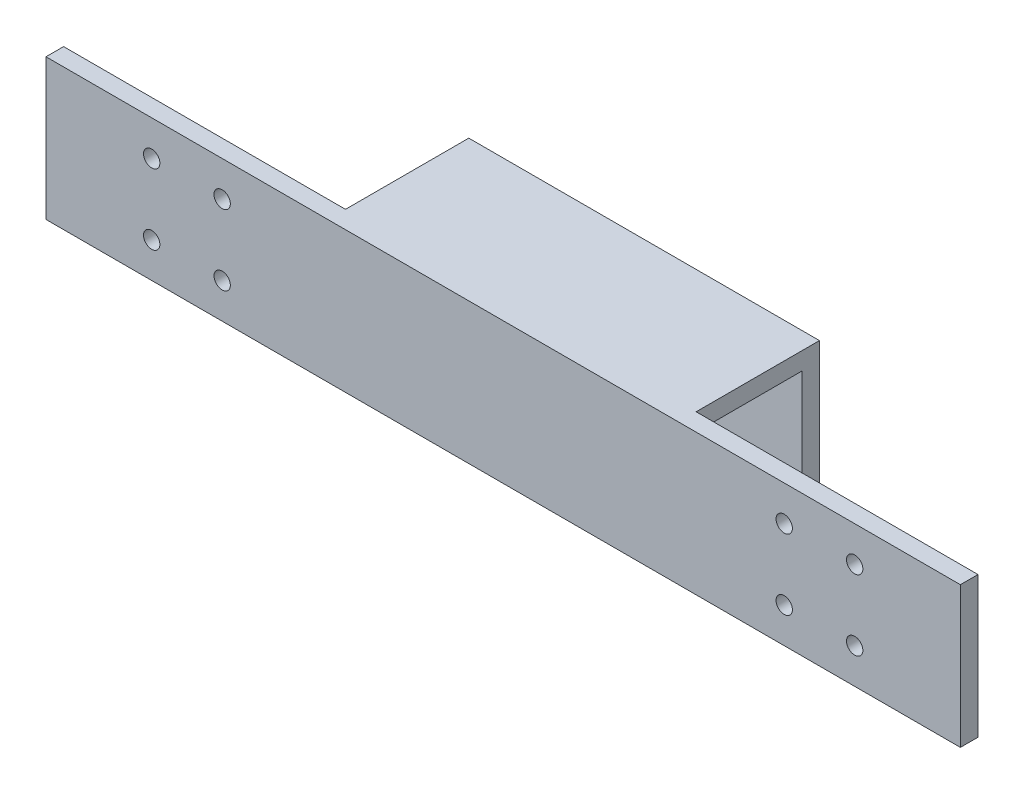
ISO-10303-21;
HEADER;
FILE_DESCRIPTION(('STEP AP214'),'2;1');
FILE_NAME('part.step','',(''),(''),'','','');
FILE_SCHEMA(('AUTOMOTIVE_DESIGN { 1 0 10303 214 1 1 1 1 }'));
ENDSEC;
DATA;
#1=APPLICATION_CONTEXT('core data for automotive mechanical design processes');
#2=APPLICATION_PROTOCOL_DEFINITION('international standard','automotive_design',2000,#1);
#3=PRODUCT_CONTEXT('',#1,'mechanical');
#4=PRODUCT('Part','Part','',(#3));
#5=PRODUCT_RELATED_PRODUCT_CATEGORY('part','',(#4));
#6=PRODUCT_DEFINITION_FORMATION('','',#4);
#7=PRODUCT_DEFINITION_CONTEXT('part definition',#1,'design');
#8=PRODUCT_DEFINITION('design','',#6,#7);
#9=PRODUCT_DEFINITION_SHAPE('','',#8);
#10=(LENGTH_UNIT() NAMED_UNIT(*) SI_UNIT(.MILLI.,.METRE.));
#11=(NAMED_UNIT(*) PLANE_ANGLE_UNIT() SI_UNIT($,.RADIAN.));
#12=(NAMED_UNIT(*) SI_UNIT($,.STERADIAN.) SOLID_ANGLE_UNIT());
#13=UNCERTAINTY_MEASURE_WITH_UNIT(LENGTH_MEASURE(1.E-05),#10,'distance_accuracy_value','');
#14=(GEOMETRIC_REPRESENTATION_CONTEXT(3) GLOBAL_UNCERTAINTY_ASSIGNED_CONTEXT((#13)) GLOBAL_UNIT_ASSIGNED_CONTEXT((#10,
#11,#12)) REPRESENTATION_CONTEXT('',''));
#15=CARTESIAN_POINT('',(0.,0.,0.));
#16=DIRECTION('',(0.,0.,1.));
#17=DIRECTION('',(1.,0.,0.));
#18=AXIS2_PLACEMENT_3D('',#15,#16,#17);
#19=CARTESIAN_POINT('',(164.8,8.11967213114754,-16.1005464480874));
#20=DIRECTION('',(0.,0.,1.));
#21=DIRECTION('',(0.,-1.,0.));
#22=AXIS2_PLACEMENT_3D('',#19,#20,#21);
#23=PLANE('',#22);
#24=DIRECTION('',(0.,-1.,0.));
#25=VECTOR('',#24,1.);
#26=CARTESIAN_POINT('',(50.8,8.11967213114754,-16.1005464480874));
#27=LINE('',#26,#25);
#28=CARTESIAN_POINT('',(50.8,8.11967213114754,-16.1005464480874));
#29=VERTEX_POINT('',#28);
#30=CARTESIAN_POINT('',(50.8,-17.2803278688525,-16.1005464480874));
#31=VERTEX_POINT('',#30);
#32=EDGE_CURVE('E128',#29,#31,#27,.T.);
#33=ORIENTED_EDGE('',*,*,#32,.F.);
#34=DIRECTION('',(-1.,0.,0.));
#35=VECTOR('',#34,1.);
#36=CARTESIAN_POINT('',(164.8,8.11967213114754,-16.1005464480874));
#37=LINE('',#36,#35);
#38=CARTESIAN_POINT('',(114.,8.11967213114754,-16.1005464480874));
#39=VERTEX_POINT('',#38);
#40=EDGE_CURVE('E156',#39,#29,#37,.T.);
#41=ORIENTED_EDGE('',*,*,#40,.F.);
#42=DIRECTION('',(0.,1.,0.));
#43=VECTOR('',#42,1.);
#44=CARTESIAN_POINT('',(114.,8.11967213114754,-16.1005464480874));
#45=LINE('',#44,#43);
#46=CARTESIAN_POINT('',(114.,-17.2803278688525,-16.1005464480874));
#47=VERTEX_POINT('',#46);
#48=EDGE_CURVE('E153',#47,#39,#45,.T.);
#49=ORIENTED_EDGE('',*,*,#48,.F.);
#50=DIRECTION('',(-1.,0.,0.));
#51=VECTOR('',#50,1.);
#52=CARTESIAN_POINT('',(164.8,-17.2803278688525,-16.1005464480874));
#53=LINE('',#52,#51);
#54=EDGE_CURVE('E146',#47,#31,#53,.T.);
#55=ORIENTED_EDGE('',*,*,#54,.T.);
#56=EDGE_LOOP('',(#33,#41,#49,#55));
#57=FACE_BOUND('',#56,.T.);
#58=ADVANCED_FACE('F38',(#57),#23,.F.);
#59=CARTESIAN_POINT('',(164.8,-14.1053278688525,6.12445355191256));
#60=DIRECTION('',(0.,1.,0.));
#61=DIRECTION('',(0.,0.,1.));
#62=AXIS2_PLACEMENT_3D('',#59,#60,#61);
#63=PLANE('',#62);
#64=DIRECTION('',(-1.,0.,0.));
#65=VECTOR('',#64,1.);
#66=CARTESIAN_POINT('',(164.8,-14.1053278688525,-12.9255464480874));
#67=LINE('',#66,#65);
#68=CARTESIAN_POINT('',(114.,-14.1053278688525,-12.9255464480874));
#69=VERTEX_POINT('',#68);
#70=CARTESIAN_POINT('',(50.8,-14.1053278688525,-12.9255464480874));
#71=VERTEX_POINT('',#70);
#72=EDGE_CURVE('E243',#69,#71,#67,.T.);
#73=ORIENTED_EDGE('',*,*,#72,.T.);
#74=DIRECTION('',(0.,0.,1.));
#75=VECTOR('',#74,1.);
#76=CARTESIAN_POINT('',(50.8,-14.1053278688525,6.12445355191256));
#77=LINE('',#76,#75);
#78=CARTESIAN_POINT('',(50.8,-14.1053278688525,6.12445355191256));
#79=VERTEX_POINT('',#78);
#80=EDGE_CURVE('E323',#71,#79,#77,.T.);
#81=ORIENTED_EDGE('',*,*,#80,.T.);
#82=DIRECTION('',(-1.,0.,0.));
#83=VECTOR('',#82,1.);
#84=CARTESIAN_POINT('',(164.8,-14.1053278688525,6.12445355191256));
#85=LINE('',#84,#83);
#86=CARTESIAN_POINT('',(114.,-14.1053278688525,6.12445355191256));
#87=VERTEX_POINT('',#86);
#88=EDGE_CURVE('E252',#87,#79,#85,.T.);
#89=ORIENTED_EDGE('',*,*,#88,.F.);
#90=DIRECTION('',(0.,0.,1.));
#91=VECTOR('',#90,1.);
#92=CARTESIAN_POINT('',(114.,-14.1053278688525,6.12445355191256));
#93=LINE('',#92,#91);
#94=EDGE_CURVE('E309',#69,#87,#93,.T.);
#95=ORIENTED_EDGE('',*,*,#94,.F.);
#96=EDGE_LOOP('',(#73,#81,#89,#95));
#97=FACE_BOUND('',#96,.T.);
#98=ADVANCED_FACE('F322',(#97),#63,.T.);
#99=CARTESIAN_POINT('',(164.8,4.94467213114754,-12.9255464480874));
#100=DIRECTION('',(0.,0.,1.));
#101=DIRECTION('',(1.,0.,0.));
#102=AXIS2_PLACEMENT_3D('',#99,#100,#101);
#103=PLANE('',#102);
#104=DIRECTION('',(-1.,0.,0.));
#105=VECTOR('',#104,1.);
#106=CARTESIAN_POINT('',(164.8,4.94467213114754,-12.9255464480874));
#107=LINE('',#106,#105);
#108=CARTESIAN_POINT('',(114.,4.94467213114754,-12.9255464480874));
#109=VERTEX_POINT('',#108);
#110=CARTESIAN_POINT('',(50.8,4.94467213114754,-12.9255464480874));
#111=VERTEX_POINT('',#110);
#112=EDGE_CURVE('E238',#109,#111,#107,.T.);
#113=ORIENTED_EDGE('',*,*,#112,.T.);
#114=DIRECTION('',(0.,-1.,0.));
#115=VECTOR('',#114,1.);
#116=CARTESIAN_POINT('',(50.8,4.94467213114754,-12.9255464480874));
#117=LINE('',#116,#115);
#118=EDGE_CURVE('E56',#111,#71,#117,.T.);
#119=ORIENTED_EDGE('',*,*,#118,.T.);
#120=ORIENTED_EDGE('',*,*,#72,.F.);
#121=DIRECTION('',(0.,-1.,0.));
#122=VECTOR('',#121,1.);
#123=CARTESIAN_POINT('',(114.,4.94467213114754,-12.9255464480874));
#124=LINE('',#123,#122);
#125=EDGE_CURVE('E303',#109,#69,#124,.T.);
#126=ORIENTED_EDGE('',*,*,#125,.F.);
#127=EDGE_LOOP('',(#113,#119,#120,#126));
#128=FACE_BOUND('',#127,.T.);
#129=ADVANCED_FACE('F404',(#128),#103,.T.);
#130=CARTESIAN_POINT('',(164.8,4.94467213114754,6.12445355191256));
#131=DIRECTION('',(0.,-1.,0.));
#132=DIRECTION('',(0.,0.,-1.));
#133=AXIS2_PLACEMENT_3D('',#130,#131,#132);
#134=PLANE('',#133);
#135=DIRECTION('',(-1.,0.,0.));
#136=VECTOR('',#135,1.);
#137=CARTESIAN_POINT('',(164.8,4.94467213114754,6.12445355191256));
#138=LINE('',#137,#136);
#139=CARTESIAN_POINT('',(114.,4.94467213114754,6.12445355191256));
#140=VERTEX_POINT('',#139);
#141=CARTESIAN_POINT('',(50.8,4.94467213114754,6.12445355191256));
#142=VERTEX_POINT('',#141);
#143=EDGE_CURVE('E227',#140,#142,#138,.T.);
#144=ORIENTED_EDGE('',*,*,#143,.T.);
#145=DIRECTION('',(0.,0.,-1.));
#146=VECTOR('',#145,1.);
#147=CARTESIAN_POINT('',(50.8,4.94467213114754,6.12445355191256));
#148=LINE('',#147,#146);
#149=EDGE_CURVE('E11',#142,#111,#148,.T.);
#150=ORIENTED_EDGE('',*,*,#149,.T.);
#151=ORIENTED_EDGE('',*,*,#112,.F.);
#152=DIRECTION('',(0.,0.,-1.));
#153=VECTOR('',#152,1.);
#154=CARTESIAN_POINT('',(114.,4.94467213114754,6.12445355191256));
#155=LINE('',#154,#153);
#156=EDGE_CURVE('E48',#140,#109,#155,.T.);
#157=ORIENTED_EDGE('',*,*,#156,.F.);
#158=EDGE_LOOP('',(#144,#150,#151,#157));
#159=FACE_BOUND('',#158,.T.);
#160=ADVANCED_FACE('F234',(#159),#134,.T.);
#161=CARTESIAN_POINT('',(164.8,0.,0.));
#162=DIRECTION('',(1.,0.,0.));
#163=DIRECTION('',(0.,0.,-1.));
#164=AXIS2_PLACEMENT_3D('',#161,#162,#163);
#165=PLANE('',#164);
#166=DIRECTION('',(0.,-1.,0.));
#167=VECTOR('',#166,1.);
#168=CARTESIAN_POINT('',(164.8,4.94467213114754,6.12445355191256));
#169=LINE('',#168,#167);
#170=CARTESIAN_POINT('',(164.8,8.11967213114754,6.12445355191256));
#171=VERTEX_POINT('',#170);
#172=CARTESIAN_POINT('',(164.8,-17.2803278688525,6.12445355191256));
#173=VERTEX_POINT('',#172);
#174=EDGE_CURVE('E239',#171,#173,#169,.T.);
#175=ORIENTED_EDGE('',*,*,#174,.F.);
#176=DIRECTION('',(0.,0.,1.));
#177=VECTOR('',#176,1.);
#178=CARTESIAN_POINT('',(164.8,8.11967213114754,9.29945355191256));
#179=LINE('',#178,#177);
#180=CARTESIAN_POINT('',(164.8,8.11967213114754,9.29945355191256));
#181=VERTEX_POINT('',#180);
#182=EDGE_CURVE('E266',#171,#181,#179,.T.);
#183=ORIENTED_EDGE('',*,*,#182,.T.);
#184=DIRECTION('',(0.,-1.,0.));
#185=VECTOR('',#184,1.);
#186=CARTESIAN_POINT('',(164.8,8.11967213114754,9.29945355191256));
#187=LINE('',#186,#185);
#188=CARTESIAN_POINT('',(164.8,-17.2803278688525,9.29945355191256));
#189=VERTEX_POINT('',#188);
#190=EDGE_CURVE('E257',#181,#189,#187,.T.);
#191=ORIENTED_EDGE('',*,*,#190,.T.);
#192=DIRECTION('',(0.,0.,-1.));
#193=VECTOR('',#192,1.);
#194=CARTESIAN_POINT('',(164.8,-17.2803278688525,9.29945355191256));
#195=LINE('',#194,#193);
#196=EDGE_CURVE('E261',#189,#173,#195,.T.);
#197=ORIENTED_EDGE('',*,*,#196,.T.);
#198=EDGE_LOOP('',(#175,#183,#191,#197));
#199=FACE_BOUND('',#198,.T.);
#200=ADVANCED_FACE('F292',(#199),#165,.T.);
#201=CARTESIAN_POINT('',(0.,0.,0.));
#202=DIRECTION('',(1.,0.,0.));
#203=DIRECTION('',(0.,0.,-1.));
#204=AXIS2_PLACEMENT_3D('',#201,#202,#203);
#205=PLANE('',#204);
#206=DIRECTION('',(0.,0.,1.));
#207=VECTOR('',#206,1.);
#208=CARTESIAN_POINT('',(0.,8.11967213114754,9.29945355191256));
#209=LINE('',#208,#207);
#210=CARTESIAN_POINT('',(0.,8.11967213114754,6.12445355191256));
#211=VERTEX_POINT('',#210);
#212=CARTESIAN_POINT('',(0.,8.11967213114754,9.29945355191256));
#213=VERTEX_POINT('',#212);
#214=EDGE_CURVE('E262',#211,#213,#209,.T.);
#215=ORIENTED_EDGE('',*,*,#214,.F.);
#216=DIRECTION('',(0.,-1.,0.));
#217=VECTOR('',#216,1.);
#218=CARTESIAN_POINT('',(0.,4.94467213114754,6.12445355191256));
#219=LINE('',#218,#217);
#220=CARTESIAN_POINT('',(0.,-17.2803278688525,6.12445355191256));
#221=VERTEX_POINT('',#220);
#222=EDGE_CURVE('E245',#211,#221,#219,.T.);
#223=ORIENTED_EDGE('',*,*,#222,.T.);
#224=DIRECTION('',(0.,0.,-1.));
#225=VECTOR('',#224,1.);
#226=CARTESIAN_POINT('',(0.,-17.2803278688525,9.29945355191256));
#227=LINE('',#226,#225);
#228=CARTESIAN_POINT('',(0.,-17.2803278688525,9.29945355191256));
#229=VERTEX_POINT('',#228);
#230=EDGE_CURVE('E272',#229,#221,#227,.T.);
#231=ORIENTED_EDGE('',*,*,#230,.F.);
#232=DIRECTION('',(0.,-1.,0.));
#233=VECTOR('',#232,1.);
#234=CARTESIAN_POINT('',(0.,8.11967213114754,9.29945355191256));
#235=LINE('',#234,#233);
#236=EDGE_CURVE('E256',#213,#229,#235,.T.);
#237=ORIENTED_EDGE('',*,*,#236,.F.);
#238=EDGE_LOOP('',(#215,#223,#231,#237));
#239=FACE_BOUND('',#238,.T.);
#240=ADVANCED_FACE('F287',(#239),#205,.F.);
#241=CARTESIAN_POINT('',(164.8,8.11967213114754,9.29945355191256));
#242=DIRECTION('',(0.,0.,-1.));
#243=DIRECTION('',(0.,1.,0.));
#244=AXIS2_PLACEMENT_3D('',#241,#242,#243);
#245=PLANE('',#244);
#246=CARTESIAN_POINT('',(145.75,-10.9303278688525,9.29945355191256));
#247=DIRECTION('',(0.,0.,1.));
#248=DIRECTION('',(1.,0.,0.));
#249=AXIS2_PLACEMENT_3D('',#246,#247,#248);
#250=CIRCLE('',#249,1.4732);
#251=CARTESIAN_POINT('',(147.2232,-10.9303278688525,9.29945355191256));
#252=VERTEX_POINT('',#251);
#253=EDGE_CURVE('E353',#252,#252,#250,.T.);
#254=ORIENTED_EDGE('',*,*,#253,.F.);
#255=EDGE_LOOP('',(#254));
#256=FACE_BOUND('',#255,.T.);
#257=CARTESIAN_POINT('',(19.05,-10.9303278688525,9.29945355191256));
#258=DIRECTION('',(0.,0.,1.));
#259=DIRECTION('',(-1.,0.,0.));
#260=AXIS2_PLACEMENT_3D('',#257,#258,#259);
#261=CIRCLE('',#260,1.4732);
#262=CARTESIAN_POINT('',(17.5768,-10.9303278688525,9.29945355191256));
#263=VERTEX_POINT('',#262);
#264=EDGE_CURVE('E349',#263,#263,#261,.T.);
#265=ORIENTED_EDGE('',*,*,#264,.F.);
#266=EDGE_LOOP('',(#265));
#267=FACE_BOUND('',#266,.T.);
#268=CARTESIAN_POINT('',(31.75,-10.9303278688525,9.29945355191256));
#269=DIRECTION('',(0.,0.,1.));
#270=DIRECTION('',(1.,0.,0.));
#271=AXIS2_PLACEMENT_3D('',#268,#269,#270);
#272=CIRCLE('',#271,1.47319999999999);
#273=CARTESIAN_POINT('',(33.2232,-10.9303278688525,9.29945355191256));
#274=VERTEX_POINT('',#273);
#275=EDGE_CURVE('E345',#274,#274,#272,.T.);
#276=ORIENTED_EDGE('',*,*,#275,.F.);
#277=EDGE_LOOP('',(#276));
#278=FACE_BOUND('',#277,.T.);
#279=CARTESIAN_POINT('',(31.75,1.76967213114754,9.29945355191256));
#280=DIRECTION('',(0.,0.,1.));
#281=DIRECTION('',(-1.,0.,0.));
#282=AXIS2_PLACEMENT_3D('',#279,#280,#281);
#283=CIRCLE('',#282,1.4732);
#284=CARTESIAN_POINT('',(30.2768,1.76967213114754,9.29945355191256));
#285=VERTEX_POINT('',#284);
#286=EDGE_CURVE('E344',#285,#285,#283,.T.);
#287=ORIENTED_EDGE('',*,*,#286,.F.);
#288=EDGE_LOOP('',(#287));
#289=FACE_BOUND('',#288,.T.);
#290=CARTESIAN_POINT('',(133.05,-10.9303278688525,9.29945355191256));
#291=DIRECTION('',(0.,0.,1.));
#292=DIRECTION('',(-1.,0.,0.));
#293=AXIS2_PLACEMENT_3D('',#290,#291,#292);
#294=CIRCLE('',#293,1.4732);
#295=CARTESIAN_POINT('',(131.5768,-10.9303278688525,9.29945355191256));
#296=VERTEX_POINT('',#295);
#297=EDGE_CURVE('E357',#296,#296,#294,.T.);
#298=ORIENTED_EDGE('',*,*,#297,.F.);
#299=EDGE_LOOP('',(#298));
#300=FACE_BOUND('',#299,.T.);
#301=CARTESIAN_POINT('',(133.05,1.76967213114754,9.29945355191256));
#302=DIRECTION('',(0.,0.,1.));
#303=DIRECTION('',(1.,0.,0.));
#304=AXIS2_PLACEMENT_3D('',#301,#302,#303);
#305=CIRCLE('',#304,1.4732);
#306=CARTESIAN_POINT('',(134.5232,1.76967213114754,9.29945355191256));
#307=VERTEX_POINT('',#306);
#308=EDGE_CURVE('E365',#307,#307,#305,.T.);
#309=ORIENTED_EDGE('',*,*,#308,.F.);
#310=EDGE_LOOP('',(#309));
#311=FACE_BOUND('',#310,.T.);
#312=CARTESIAN_POINT('',(145.75,1.76967213114754,9.29945355191256));
#313=DIRECTION('',(0.,0.,1.));
#314=DIRECTION('',(-1.,0.,0.));
#315=AXIS2_PLACEMENT_3D('',#312,#313,#314);
#316=CIRCLE('',#315,1.4732);
#317=CARTESIAN_POINT('',(144.2768,1.76967213114754,9.29945355191256));
#318=VERTEX_POINT('',#317);
#319=EDGE_CURVE('E361',#318,#318,#316,.T.);
#320=ORIENTED_EDGE('',*,*,#319,.F.);
#321=EDGE_LOOP('',(#320));
#322=FACE_BOUND('',#321,.T.);
#323=CARTESIAN_POINT('',(19.05,1.76967213114754,9.29945355191256));
#324=DIRECTION('',(0.,0.,1.));
#325=DIRECTION('',(1.,0.,0.));
#326=AXIS2_PLACEMENT_3D('',#323,#324,#325);
#327=CIRCLE('',#326,1.4732);
#328=CARTESIAN_POINT('',(20.5232,1.76967213114754,9.29945355191256));
#329=VERTEX_POINT('',#328);
#330=EDGE_CURVE('E173',#329,#329,#327,.T.);
#331=ORIENTED_EDGE('',*,*,#330,.F.);
#332=EDGE_LOOP('',(#331));
#333=FACE_BOUND('',#332,.T.);
#334=ORIENTED_EDGE('',*,*,#236,.T.);
#335=DIRECTION('',(-1.,0.,0.));
#336=VECTOR('',#335,1.);
#337=CARTESIAN_POINT('',(164.8,-17.2803278688525,9.29945355191256));
#338=LINE('',#337,#336);
#339=EDGE_CURVE('E155',#189,#229,#338,.T.);
#340=ORIENTED_EDGE('',*,*,#339,.F.);
#341=ORIENTED_EDGE('',*,*,#190,.F.);
#342=DIRECTION('',(-1.,0.,0.));
#343=VECTOR('',#342,1.);
#344=CARTESIAN_POINT('',(164.8,8.11967213114754,9.29945355191256));
#345=LINE('',#344,#343);
#346=EDGE_CURVE('E162',#181,#213,#345,.T.);
#347=ORIENTED_EDGE('',*,*,#346,.T.);
#348=EDGE_LOOP('',(#334,#340,#341,#347));
#349=FACE_BOUND('',#348,.T.);
#350=ADVANCED_FACE('F40',(#256,#267,#278,#289,#300,#311,#322,#333,#349),#245,.F.);
#351=CARTESIAN_POINT('',(164.8,-17.2803278688525,9.29945355191256));
#352=DIRECTION('',(0.,1.,0.));
#353=DIRECTION('',(0.,0.,1.));
#354=AXIS2_PLACEMENT_3D('',#351,#352,#353);
#355=PLANE('',#354);
#356=ORIENTED_EDGE('',*,*,#230,.T.);
#357=DIRECTION('',(-1.,0.,0.));
#358=VECTOR('',#357,1.);
#359=CARTESIAN_POINT('',(50.8,-17.2803278688525,6.12445355191256));
#360=LINE('',#359,#358);
#361=CARTESIAN_POINT('',(50.8,-17.2803278688525,6.12445355191256));
#362=VERTEX_POINT('',#361);
#363=EDGE_CURVE('E148',#362,#221,#360,.T.);
#364=ORIENTED_EDGE('',*,*,#363,.F.);
#365=DIRECTION('',(0.,0.,1.));
#366=VECTOR('',#365,1.);
#367=CARTESIAN_POINT('',(50.8,-17.2803278688525,-16.1005464480874));
#368=LINE('',#367,#366);
#369=EDGE_CURVE('E131',#31,#362,#368,.T.);
#370=ORIENTED_EDGE('',*,*,#369,.F.);
#371=ORIENTED_EDGE('',*,*,#54,.F.);
#372=DIRECTION('',(0.,0.,-1.));
#373=VECTOR('',#372,1.);
#374=CARTESIAN_POINT('',(114.,-17.2803278688525,-16.1005464480874));
#375=LINE('',#374,#373);
#376=CARTESIAN_POINT('',(114.,-17.2803278688525,6.12445355191256));
#377=VERTEX_POINT('',#376);
#378=EDGE_CURVE('E299',#377,#47,#375,.T.);
#379=ORIENTED_EDGE('',*,*,#378,.F.);
#380=DIRECTION('',(1.,0.,0.));
#381=VECTOR('',#380,1.);
#382=CARTESIAN_POINT('',(114.,-17.2803278688525,6.12445355191256));
#383=LINE('',#382,#381);
#384=EDGE_CURVE('E290',#377,#173,#383,.T.);
#385=ORIENTED_EDGE('',*,*,#384,.T.);
#386=ORIENTED_EDGE('',*,*,#196,.F.);
#387=ORIENTED_EDGE('',*,*,#339,.T.);
#388=EDGE_LOOP('',(#356,#364,#370,#371,#379,#385,#386,#387));
#389=FACE_BOUND('',#388,.T.);
#390=ADVANCED_FACE('F144',(#389),#355,.F.);
#391=CARTESIAN_POINT('',(164.8,8.11967213114754,9.29945355191256));
#392=DIRECTION('',(0.,-1.,0.));
#393=DIRECTION('',(0.,0.,-1.));
#394=AXIS2_PLACEMENT_3D('',#391,#392,#393);
#395=PLANE('',#394);
#396=DIRECTION('',(0.,0.,-1.));
#397=VECTOR('',#396,1.);
#398=CARTESIAN_POINT('',(50.8,8.11967213114754,-16.1005464480874));
#399=LINE('',#398,#397);
#400=CARTESIAN_POINT('',(50.8,8.11967213114754,6.12445355191256));
#401=VERTEX_POINT('',#400);
#402=EDGE_CURVE('E134',#401,#29,#399,.T.);
#403=ORIENTED_EDGE('',*,*,#402,.F.);
#404=DIRECTION('',(-1.,0.,0.));
#405=VECTOR('',#404,1.);
#406=CARTESIAN_POINT('',(50.8,8.11967213114754,6.12445355191256));
#407=LINE('',#406,#405);
#408=EDGE_CURVE('E229',#401,#211,#407,.T.);
#409=ORIENTED_EDGE('',*,*,#408,.T.);
#410=ORIENTED_EDGE('',*,*,#214,.T.);
#411=ORIENTED_EDGE('',*,*,#346,.F.);
#412=ORIENTED_EDGE('',*,*,#182,.F.);
#413=DIRECTION('',(1.,0.,0.));
#414=VECTOR('',#413,1.);
#415=CARTESIAN_POINT('',(114.,8.11967213114754,6.12445355191256));
#416=LINE('',#415,#414);
#417=CARTESIAN_POINT('',(114.,8.11967213114754,6.12445355191256));
#418=VERTEX_POINT('',#417);
#419=EDGE_CURVE('E296',#418,#171,#416,.T.);
#420=ORIENTED_EDGE('',*,*,#419,.F.);
#421=DIRECTION('',(0.,0.,1.));
#422=VECTOR('',#421,1.);
#423=CARTESIAN_POINT('',(114.,8.11967213114754,-16.1005464480874));
#424=LINE('',#423,#422);
#425=EDGE_CURVE('E297',#39,#418,#424,.T.);
#426=ORIENTED_EDGE('',*,*,#425,.F.);
#427=ORIENTED_EDGE('',*,*,#40,.T.);
#428=EDGE_LOOP('',(#403,#409,#410,#411,#412,#420,#426,#427));
#429=FACE_BOUND('',#428,.T.);
#430=ADVANCED_FACE('F208',(#429),#395,.F.);
#431=CARTESIAN_POINT('',(164.8,4.94467213114754,6.12445355191256));
#432=DIRECTION('',(0.,0.,-1.));
#433=DIRECTION('',(-1.,0.,0.));
#434=AXIS2_PLACEMENT_3D('',#431,#432,#433);
#435=PLANE('',#434);
#436=CARTESIAN_POINT('',(145.75,-10.9303278688525,6.12445355191257));
#437=DIRECTION('',(0.,0.,-1.));
#438=DIRECTION('',(-1.,0.,0.));
#439=AXIS2_PLACEMENT_3D('',#436,#437,#438);
#440=CIRCLE('',#439,1.4732);
#441=CARTESIAN_POINT('',(144.2768,-10.9303278688525,6.12445355191257));
#442=VERTEX_POINT('',#441);
#443=EDGE_CURVE('E42',#442,#442,#440,.T.);
#444=ORIENTED_EDGE('',*,*,#443,.F.);
#445=EDGE_LOOP('',(#444));
#446=FACE_BOUND('',#445,.T.);
#447=CARTESIAN_POINT('',(19.05,-10.9303278688525,6.12445355191257));
#448=DIRECTION('',(0.,0.,-1.));
#449=DIRECTION('',(-1.,0.,0.));
#450=AXIS2_PLACEMENT_3D('',#447,#448,#449);
#451=CIRCLE('',#450,1.4732);
#452=CARTESIAN_POINT('',(17.5768,-10.9303278688525,6.12445355191257));
#453=VERTEX_POINT('',#452);
#454=EDGE_CURVE('E192',#453,#453,#451,.T.);
#455=ORIENTED_EDGE('',*,*,#454,.F.);
#456=EDGE_LOOP('',(#455));
#457=FACE_BOUND('',#456,.T.);
#458=CARTESIAN_POINT('',(31.75,-10.9303278688525,6.12445355191257));
#459=DIRECTION('',(0.,0.,-1.));
#460=DIRECTION('',(-1.,0.,0.));
#461=AXIS2_PLACEMENT_3D('',#458,#459,#460);
#462=CIRCLE('',#461,1.47319999999999);
#463=CARTESIAN_POINT('',(30.2768,-10.9303278688525,6.12445355191257));
#464=VERTEX_POINT('',#463);
#465=EDGE_CURVE('E189',#464,#464,#462,.T.);
#466=ORIENTED_EDGE('',*,*,#465,.F.);
#467=EDGE_LOOP('',(#466));
#468=FACE_BOUND('',#467,.T.);
#469=CARTESIAN_POINT('',(31.75,1.76967213114754,6.12445355191257));
#470=DIRECTION('',(0.,0.,-1.));
#471=DIRECTION('',(-1.,0.,0.));
#472=AXIS2_PLACEMENT_3D('',#469,#470,#471);
#473=CIRCLE('',#472,1.4732);
#474=CARTESIAN_POINT('',(30.2768,1.76967213114754,6.12445355191257));
#475=VERTEX_POINT('',#474);
#476=EDGE_CURVE('E185',#475,#475,#473,.T.);
#477=ORIENTED_EDGE('',*,*,#476,.F.);
#478=EDGE_LOOP('',(#477));
#479=FACE_BOUND('',#478,.T.);
#480=CARTESIAN_POINT('',(133.05,-10.9303278688525,6.12445355191257));
#481=DIRECTION('',(0.,0.,-1.));
#482=DIRECTION('',(-1.,0.,0.));
#483=AXIS2_PLACEMENT_3D('',#480,#481,#482);
#484=CIRCLE('',#483,1.4732);
#485=CARTESIAN_POINT('',(131.5768,-10.9303278688525,6.12445355191257));
#486=VERTEX_POINT('',#485);
#487=EDGE_CURVE('E181',#486,#486,#484,.T.);
#488=ORIENTED_EDGE('',*,*,#487,.F.);
#489=EDGE_LOOP('',(#488));
#490=FACE_BOUND('',#489,.T.);
#491=CARTESIAN_POINT('',(133.05,1.76967213114754,6.12445355191257));
#492=DIRECTION('',(0.,0.,-1.));
#493=DIRECTION('',(-1.,0.,0.));
#494=AXIS2_PLACEMENT_3D('',#491,#492,#493);
#495=CIRCLE('',#494,1.4732);
#496=CARTESIAN_POINT('',(131.5768,1.76967213114754,6.12445355191257));
#497=VERTEX_POINT('',#496);
#498=EDGE_CURVE('E177',#497,#497,#495,.T.);
#499=ORIENTED_EDGE('',*,*,#498,.F.);
#500=EDGE_LOOP('',(#499));
#501=FACE_BOUND('',#500,.T.);
#502=CARTESIAN_POINT('',(145.75,1.76967213114754,6.12445355191257));
#503=DIRECTION('',(0.,0.,-1.));
#504=DIRECTION('',(-1.,0.,0.));
#505=AXIS2_PLACEMENT_3D('',#502,#503,#504);
#506=CIRCLE('',#505,1.4732);
#507=CARTESIAN_POINT('',(144.2768,1.76967213114754,6.12445355191257));
#508=VERTEX_POINT('',#507);
#509=EDGE_CURVE('E172',#508,#508,#506,.T.);
#510=ORIENTED_EDGE('',*,*,#509,.F.);
#511=EDGE_LOOP('',(#510));
#512=FACE_BOUND('',#511,.T.);
#513=CARTESIAN_POINT('',(19.05,1.76967213114754,6.12445355191257));
#514=DIRECTION('',(0.,0.,-1.));
#515=DIRECTION('',(-1.,0.,0.));
#516=AXIS2_PLACEMENT_3D('',#513,#514,#515);
#517=CIRCLE('',#516,1.4732);
#518=CARTESIAN_POINT('',(17.5768,1.76967213114754,6.12445355191257));
#519=VERTEX_POINT('',#518);
#520=EDGE_CURVE('E168',#519,#519,#517,.T.);
#521=ORIENTED_EDGE('',*,*,#520,.F.);
#522=EDGE_LOOP('',(#521));
#523=FACE_BOUND('',#522,.T.);
#524=DIRECTION('',(0.,1.,0.));
#525=VECTOR('',#524,1.);
#526=CARTESIAN_POINT('',(50.8,8.11967213114754,6.12445355191256));
#527=LINE('',#526,#525);
#528=EDGE_CURVE('E150',#142,#401,#527,.T.);
#529=ORIENTED_EDGE('',*,*,#528,.F.);
#530=ORIENTED_EDGE('',*,*,#143,.F.);
#531=DIRECTION('',(0.,-1.,0.));
#532=VECTOR('',#531,1.);
#533=CARTESIAN_POINT('',(114.,8.11967213114754,6.12445355191256));
#534=LINE('',#533,#532);
#535=EDGE_CURVE('E63',#418,#140,#534,.T.);
#536=ORIENTED_EDGE('',*,*,#535,.F.);
#537=ORIENTED_EDGE('',*,*,#419,.T.);
#538=ORIENTED_EDGE('',*,*,#174,.T.);
#539=ORIENTED_EDGE('',*,*,#384,.F.);
#540=EDGE_CURVE('E314',#87,#377,#534,.T.);
#541=ORIENTED_EDGE('',*,*,#540,.F.);
#542=ORIENTED_EDGE('',*,*,#88,.T.);
#543=EDGE_CURVE('E231',#362,#79,#527,.T.);
#544=ORIENTED_EDGE('',*,*,#543,.F.);
#545=ORIENTED_EDGE('',*,*,#363,.T.);
#546=ORIENTED_EDGE('',*,*,#222,.F.);
#547=ORIENTED_EDGE('',*,*,#408,.F.);
#548=EDGE_LOOP('',(#529,#530,#536,#537,#538,#539,#541,#542,#544,#545,#546,#547));
#549=FACE_BOUND('',#548,.T.);
#550=ADVANCED_FACE('F204',(#446,#457,#468,#479,#490,#501,#512,#523,#549),#435,.T.);
#551=CARTESIAN_POINT('',(114.,0.,0.));
#552=DIRECTION('',(-1.,0.,0.));
#553=DIRECTION('',(0.,0.,1.));
#554=AXIS2_PLACEMENT_3D('',#551,#552,#553);
#555=PLANE('',#554);
#556=ORIENTED_EDGE('',*,*,#94,.T.);
#557=ORIENTED_EDGE('',*,*,#540,.T.);
#558=ORIENTED_EDGE('',*,*,#378,.T.);
#559=ORIENTED_EDGE('',*,*,#48,.T.);
#560=ORIENTED_EDGE('',*,*,#425,.T.);
#561=ORIENTED_EDGE('',*,*,#535,.T.);
#562=ORIENTED_EDGE('',*,*,#156,.T.);
#563=ORIENTED_EDGE('',*,*,#125,.T.);
#564=EDGE_LOOP('',(#556,#557,#558,#559,#560,#561,#562,#563));
#565=FACE_BOUND('',#564,.T.);
#566=ADVANCED_FACE('F207',(#565),#555,.F.);
#567=CARTESIAN_POINT('',(50.8,0.,0.));
#568=DIRECTION('',(-1.,0.,0.));
#569=DIRECTION('',(0.,0.,1.));
#570=AXIS2_PLACEMENT_3D('',#567,#568,#569);
#571=PLANE('',#570);
#572=ORIENTED_EDGE('',*,*,#118,.F.);
#573=ORIENTED_EDGE('',*,*,#149,.F.);
#574=ORIENTED_EDGE('',*,*,#528,.T.);
#575=ORIENTED_EDGE('',*,*,#402,.T.);
#576=ORIENTED_EDGE('',*,*,#32,.T.);
#577=ORIENTED_EDGE('',*,*,#369,.T.);
#578=ORIENTED_EDGE('',*,*,#543,.T.);
#579=ORIENTED_EDGE('',*,*,#80,.F.);
#580=EDGE_LOOP('',(#572,#573,#574,#575,#576,#577,#578,#579));
#581=FACE_BOUND('',#580,.T.);
#582=ADVANCED_FACE('F130',(#581),#571,.T.);
#583=CARTESIAN_POINT('',(19.05,1.76967213114754,-41.5005464480874));
#584=DIRECTION('',(0.,0.,1.));
#585=DIRECTION('',(1.,0.,0.));
#586=AXIS2_PLACEMENT_3D('',#583,#584,#585);
#587=CYLINDRICAL_SURFACE('',#586,1.4732);
#588=ORIENTED_EDGE('',*,*,#520,.T.);
#589=EDGE_LOOP('',(#588));
#590=FACE_BOUND('',#589,.T.);
#591=ORIENTED_EDGE('',*,*,#330,.T.);
#592=EDGE_LOOP('',(#591));
#593=FACE_BOUND('',#592,.T.);
#594=ADVANCED_FACE('F384',(#590,#593),#587,.F.);
#595=CARTESIAN_POINT('',(145.75,1.76967213114754,-41.5005464480874));
#596=DIRECTION('',(0.,0.,1.));
#597=DIRECTION('',(1.,0.,0.));
#598=AXIS2_PLACEMENT_3D('',#595,#596,#597);
#599=CYLINDRICAL_SURFACE('',#598,1.4732);
#600=ORIENTED_EDGE('',*,*,#509,.T.);
#601=EDGE_LOOP('',(#600));
#602=FACE_BOUND('',#601,.T.);
#603=ORIENTED_EDGE('',*,*,#319,.T.);
#604=EDGE_LOOP('',(#603));
#605=FACE_BOUND('',#604,.T.);
#606=ADVANCED_FACE('F386',(#602,#605),#599,.F.);
#607=CARTESIAN_POINT('',(133.05,1.76967213114754,-41.5005464480874));
#608=DIRECTION('',(0.,0.,1.));
#609=DIRECTION('',(1.,0.,0.));
#610=AXIS2_PLACEMENT_3D('',#607,#608,#609);
#611=CYLINDRICAL_SURFACE('',#610,1.4732);
#612=ORIENTED_EDGE('',*,*,#498,.T.);
#613=EDGE_LOOP('',(#612));
#614=FACE_BOUND('',#613,.T.);
#615=ORIENTED_EDGE('',*,*,#308,.T.);
#616=EDGE_LOOP('',(#615));
#617=FACE_BOUND('',#616,.T.);
#618=ADVANCED_FACE('F393',(#614,#617),#611,.F.);
#619=CARTESIAN_POINT('',(133.05,-10.9303278688525,-41.5005464480874));
#620=DIRECTION('',(0.,0.,1.));
#621=DIRECTION('',(1.,0.,0.));
#622=AXIS2_PLACEMENT_3D('',#619,#620,#621);
#623=CYLINDRICAL_SURFACE('',#622,1.4732);
#624=ORIENTED_EDGE('',*,*,#487,.T.);
#625=EDGE_LOOP('',(#624));
#626=FACE_BOUND('',#625,.T.);
#627=ORIENTED_EDGE('',*,*,#297,.T.);
#628=EDGE_LOOP('',(#627));
#629=FACE_BOUND('',#628,.T.);
#630=ADVANCED_FACE('F373',(#626,#629),#623,.F.);
#631=CARTESIAN_POINT('',(31.75,1.76967213114754,-41.5005464480874));
#632=DIRECTION('',(0.,0.,1.));
#633=DIRECTION('',(1.,0.,0.));
#634=AXIS2_PLACEMENT_3D('',#631,#632,#633);
#635=CYLINDRICAL_SURFACE('',#634,1.4732);
#636=ORIENTED_EDGE('',*,*,#476,.T.);
#637=EDGE_LOOP('',(#636));
#638=FACE_BOUND('',#637,.T.);
#639=ORIENTED_EDGE('',*,*,#286,.T.);
#640=EDGE_LOOP('',(#639));
#641=FACE_BOUND('',#640,.T.);
#642=ADVANCED_FACE('F459',(#638,#641),#635,.F.);
#643=CARTESIAN_POINT('',(31.75,-10.9303278688525,-41.5005464480874));
#644=DIRECTION('',(0.,0.,1.));
#645=DIRECTION('',(1.,0.,0.));
#646=AXIS2_PLACEMENT_3D('',#643,#644,#645);
#647=CYLINDRICAL_SURFACE('',#646,1.47319999999999);
#648=ORIENTED_EDGE('',*,*,#465,.T.);
#649=EDGE_LOOP('',(#648));
#650=FACE_BOUND('',#649,.T.);
#651=ORIENTED_EDGE('',*,*,#275,.T.);
#652=EDGE_LOOP('',(#651));
#653=FACE_BOUND('',#652,.T.);
#654=ADVANCED_FACE('F469',(#650,#653),#647,.F.);
#655=CARTESIAN_POINT('',(19.05,-10.9303278688525,-41.5005464480874));
#656=DIRECTION('',(0.,0.,1.));
#657=DIRECTION('',(1.,0.,0.));
#658=AXIS2_PLACEMENT_3D('',#655,#656,#657);
#659=CYLINDRICAL_SURFACE('',#658,1.4732);
#660=ORIENTED_EDGE('',*,*,#454,.T.);
#661=EDGE_LOOP('',(#660));
#662=FACE_BOUND('',#661,.T.);
#663=ORIENTED_EDGE('',*,*,#264,.T.);
#664=EDGE_LOOP('',(#663));
#665=FACE_BOUND('',#664,.T.);
#666=ADVANCED_FACE('F479',(#662,#665),#659,.F.);
#667=CARTESIAN_POINT('',(145.75,-10.9303278688525,-41.5005464480874));
#668=DIRECTION('',(0.,0.,1.));
#669=DIRECTION('',(1.,0.,0.));
#670=AXIS2_PLACEMENT_3D('',#667,#668,#669);
#671=CYLINDRICAL_SURFACE('',#670,1.4732);
#672=ORIENTED_EDGE('',*,*,#443,.T.);
#673=EDGE_LOOP('',(#672));
#674=FACE_BOUND('',#673,.T.);
#675=ORIENTED_EDGE('',*,*,#253,.T.);
#676=EDGE_LOOP('',(#675));
#677=FACE_BOUND('',#676,.T.);
#678=ADVANCED_FACE('F201',(#674,#677),#671,.F.);
#679=CLOSED_SHELL('',(#58,#98,#129,#160,#200,#240,#350,#390,#430,#550,#566,#582,#594,#606,#618,
#630,#642,#654,#666,#678));
#680=MANIFOLD_SOLID_BREP('B2',#679);
#681=ADVANCED_BREP_SHAPE_REPRESENTATION('',(#18,#680),#14);
#682=SHAPE_DEFINITION_REPRESENTATION(#9,#681);
ENDSEC;
END-ISO-10303-21;
